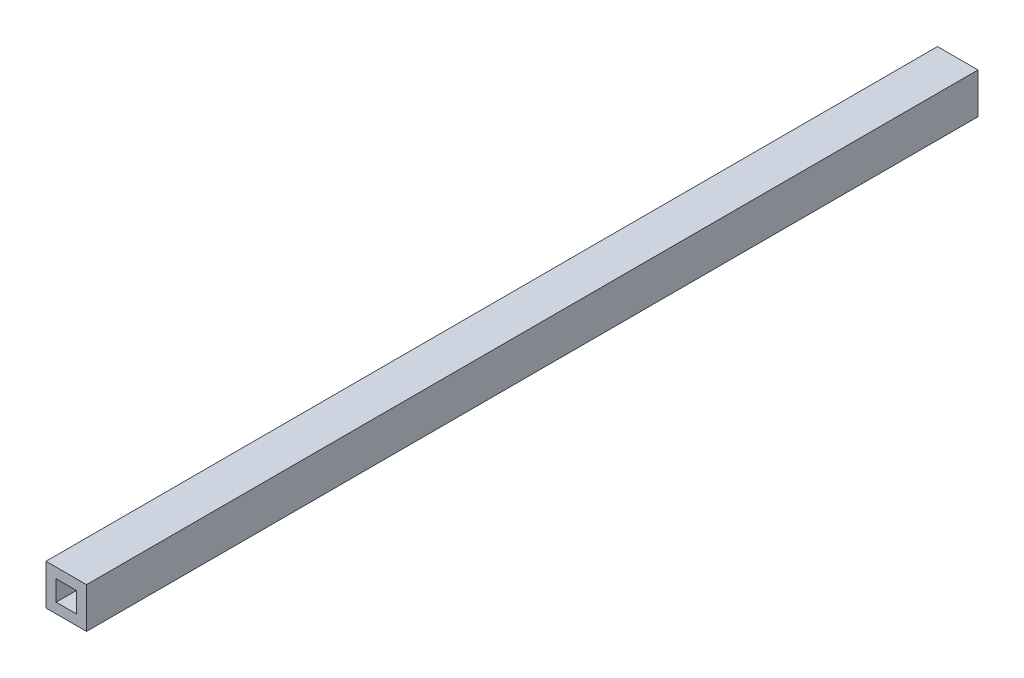
ISO-10303-21;
HEADER;
FILE_DESCRIPTION(('STEP AP214'),'2;1');
FILE_NAME('part.step','',(''),(''),'','','');
FILE_SCHEMA(('AUTOMOTIVE_DESIGN { 1 0 10303 214 1 1 1 1 }'));
ENDSEC;
DATA;
#1=APPLICATION_CONTEXT('core data for automotive mechanical design processes');
#2=APPLICATION_PROTOCOL_DEFINITION('international standard','automotive_design',2000,#1);
#3=PRODUCT_CONTEXT('',#1,'mechanical');
#4=PRODUCT('Part','Part','',(#3));
#5=PRODUCT_RELATED_PRODUCT_CATEGORY('part','',(#4));
#6=PRODUCT_DEFINITION_FORMATION('','',#4);
#7=PRODUCT_DEFINITION_CONTEXT('part definition',#1,'design');
#8=PRODUCT_DEFINITION('design','',#6,#7);
#9=PRODUCT_DEFINITION_SHAPE('','',#8);
#10=(LENGTH_UNIT() NAMED_UNIT(*) SI_UNIT(.MILLI.,.METRE.));
#11=(NAMED_UNIT(*) PLANE_ANGLE_UNIT() SI_UNIT($,.RADIAN.));
#12=(NAMED_UNIT(*) SI_UNIT($,.STERADIAN.) SOLID_ANGLE_UNIT());
#13=UNCERTAINTY_MEASURE_WITH_UNIT(LENGTH_MEASURE(1.E-05),#10,'distance_accuracy_value','');
#14=(GEOMETRIC_REPRESENTATION_CONTEXT(3) GLOBAL_UNCERTAINTY_ASSIGNED_CONTEXT((#13)) GLOBAL_UNIT_ASSIGNED_CONTEXT((#10,
#11,#12)) REPRESENTATION_CONTEXT('',''));
#15=CARTESIAN_POINT('',(0.,0.,0.));
#16=DIRECTION('',(0.,0.,1.));
#17=DIRECTION('',(1.,0.,0.));
#18=AXIS2_PLACEMENT_3D('',#15,#16,#17);
#19=CARTESIAN_POINT('',(0.,0.,440.));
#20=DIRECTION('',(0.,0.,1.));
#21=DIRECTION('',(1.,0.,0.));
#22=AXIS2_PLACEMENT_3D('',#19,#20,#21);
#23=PLANE('',#22);
#24=DIRECTION('',(0.,1.,0.));
#25=VECTOR('',#24,1.);
#26=CARTESIAN_POINT('',(10.,-10.,440.));
#27=LINE('',#26,#25);
#28=CARTESIAN_POINT('',(10.,-10.,440.));
#29=VERTEX_POINT('',#28);
#30=CARTESIAN_POINT('',(10.,10.,440.));
#31=VERTEX_POINT('',#30);
#32=EDGE_CURVE('E158',#29,#31,#27,.T.);
#33=ORIENTED_EDGE('',*,*,#32,.T.);
#34=DIRECTION('',(-1.,0.,0.));
#35=VECTOR('',#34,1.);
#36=CARTESIAN_POINT('',(-10.,10.,440.));
#37=LINE('',#36,#35);
#38=CARTESIAN_POINT('',(-10.,10.,440.));
#39=VERTEX_POINT('',#38);
#40=EDGE_CURVE('E161',#31,#39,#37,.T.);
#41=ORIENTED_EDGE('',*,*,#40,.T.);
#42=DIRECTION('',(0.,-1.,0.));
#43=VECTOR('',#42,1.);
#44=CARTESIAN_POINT('',(-10.,-10.,440.));
#45=LINE('',#44,#43);
#46=CARTESIAN_POINT('',(-10.,-10.,440.));
#47=VERTEX_POINT('',#46);
#48=EDGE_CURVE('E164',#39,#47,#45,.T.);
#49=ORIENTED_EDGE('',*,*,#48,.T.);
#50=DIRECTION('',(1.,0.,0.));
#51=VECTOR('',#50,1.);
#52=CARTESIAN_POINT('',(-10.,-10.,440.));
#53=LINE('',#52,#51);
#54=EDGE_CURVE('E166',#47,#29,#53,.T.);
#55=ORIENTED_EDGE('',*,*,#54,.T.);
#56=EDGE_LOOP('',(#33,#41,#49,#55));
#57=FACE_BOUND('',#56,.T.);
#58=DIRECTION('',(-1.,0.,0.));
#59=VECTOR('',#58,1.);
#60=CARTESIAN_POINT('',(0.,5.,440.));
#61=LINE('',#60,#59);
#62=CARTESIAN_POINT('',(5.,5.,440.));
#63=VERTEX_POINT('',#62);
#64=CARTESIAN_POINT('',(-5.,5.,440.));
#65=VERTEX_POINT('',#64);
#66=EDGE_CURVE('E130',#63,#65,#61,.T.);
#67=ORIENTED_EDGE('',*,*,#66,.F.);
#68=DIRECTION('',(0.,1.,0.));
#69=VECTOR('',#68,1.);
#70=CARTESIAN_POINT('',(5.,0.,440.));
#71=LINE('',#70,#69);
#72=CARTESIAN_POINT('',(5.,-5.,440.));
#73=VERTEX_POINT('',#72);
#74=EDGE_CURVE('E122',#73,#63,#71,.T.);
#75=ORIENTED_EDGE('',*,*,#74,.F.);
#76=DIRECTION('',(1.,0.,0.));
#77=VECTOR('',#76,1.);
#78=CARTESIAN_POINT('',(0.,-5.,440.));
#79=LINE('',#78,#77);
#80=CARTESIAN_POINT('',(-5.,-5.,440.));
#81=VERTEX_POINT('',#80);
#82=EDGE_CURVE('E144',#81,#73,#79,.T.);
#83=ORIENTED_EDGE('',*,*,#82,.F.);
#84=DIRECTION('',(0.,-1.,0.));
#85=VECTOR('',#84,1.);
#86=CARTESIAN_POINT('',(-5.,0.,440.));
#87=LINE('',#86,#85);
#88=EDGE_CURVE('E142',#65,#81,#87,.T.);
#89=ORIENTED_EDGE('',*,*,#88,.F.);
#90=EDGE_LOOP('',(#67,#75,#83,#89));
#91=FACE_BOUND('',#90,.T.);
#92=ADVANCED_FACE('F57',(#57,#91),#23,.T.);
#93=CARTESIAN_POINT('',(0.,0.,0.));
#94=DIRECTION('',(0.,0.,1.));
#95=DIRECTION('',(1.,0.,0.));
#96=AXIS2_PLACEMENT_3D('',#93,#94,#95);
#97=PLANE('',#96);
#98=DIRECTION('',(0.,1.,0.));
#99=VECTOR('',#98,1.);
#100=CARTESIAN_POINT('',(10.,-10.,0.));
#101=LINE('',#100,#99);
#102=CARTESIAN_POINT('',(10.,-10.,0.));
#103=VERTEX_POINT('',#102);
#104=CARTESIAN_POINT('',(10.,10.,0.));
#105=VERTEX_POINT('',#104);
#106=EDGE_CURVE('E138',#103,#105,#101,.T.);
#107=ORIENTED_EDGE('',*,*,#106,.F.);
#108=DIRECTION('',(1.,0.,0.));
#109=VECTOR('',#108,1.);
#110=CARTESIAN_POINT('',(-10.,-10.,0.));
#111=LINE('',#110,#109);
#112=CARTESIAN_POINT('',(-10.,-10.,0.));
#113=VERTEX_POINT('',#112);
#114=EDGE_CURVE('E162',#113,#103,#111,.T.);
#115=ORIENTED_EDGE('',*,*,#114,.F.);
#116=DIRECTION('',(0.,-1.,0.));
#117=VECTOR('',#116,1.);
#118=CARTESIAN_POINT('',(-10.,-10.,0.));
#119=LINE('',#118,#117);
#120=CARTESIAN_POINT('',(-10.,10.,0.));
#121=VERTEX_POINT('',#120);
#122=EDGE_CURVE('E173',#121,#113,#119,.T.);
#123=ORIENTED_EDGE('',*,*,#122,.F.);
#124=DIRECTION('',(-1.,0.,0.));
#125=VECTOR('',#124,1.);
#126=CARTESIAN_POINT('',(-10.,10.,0.));
#127=LINE('',#126,#125);
#128=EDGE_CURVE('E171',#105,#121,#127,.T.);
#129=ORIENTED_EDGE('',*,*,#128,.F.);
#130=EDGE_LOOP('',(#107,#115,#123,#129));
#131=FACE_BOUND('',#130,.T.);
#132=DIRECTION('',(0.,1.,0.));
#133=VECTOR('',#132,1.);
#134=CARTESIAN_POINT('',(5.,0.,0.));
#135=LINE('',#134,#133);
#136=CARTESIAN_POINT('',(5.,-5.,0.));
#137=VERTEX_POINT('',#136);
#138=CARTESIAN_POINT('',(5.,5.,0.));
#139=VERTEX_POINT('',#138);
#140=EDGE_CURVE('E80',#137,#139,#135,.T.);
#141=ORIENTED_EDGE('',*,*,#140,.T.);
#142=DIRECTION('',(-1.,0.,0.));
#143=VECTOR('',#142,1.);
#144=CARTESIAN_POINT('',(0.,5.,0.));
#145=LINE('',#144,#143);
#146=CARTESIAN_POINT('',(-5.,5.,0.));
#147=VERTEX_POINT('',#146);
#148=EDGE_CURVE('E137',#139,#147,#145,.T.);
#149=ORIENTED_EDGE('',*,*,#148,.T.);
#150=DIRECTION('',(0.,-1.,0.));
#151=VECTOR('',#150,1.);
#152=CARTESIAN_POINT('',(-5.,0.,0.));
#153=LINE('',#152,#151);
#154=CARTESIAN_POINT('',(-5.,-5.,0.));
#155=VERTEX_POINT('',#154);
#156=EDGE_CURVE('E150',#147,#155,#153,.T.);
#157=ORIENTED_EDGE('',*,*,#156,.T.);
#158=DIRECTION('',(1.,0.,0.));
#159=VECTOR('',#158,1.);
#160=CARTESIAN_POINT('',(0.,-5.,0.));
#161=LINE('',#160,#159);
#162=EDGE_CURVE('E131',#155,#137,#161,.T.);
#163=ORIENTED_EDGE('',*,*,#162,.T.);
#164=EDGE_LOOP('',(#141,#149,#157,#163));
#165=FACE_BOUND('',#164,.T.);
#166=ADVANCED_FACE('F191',(#131,#165),#97,.F.);
#167=CARTESIAN_POINT('',(10.,-10.,440.));
#168=DIRECTION('',(-1.,0.,0.));
#169=DIRECTION('',(0.,0.,1.));
#170=AXIS2_PLACEMENT_3D('',#167,#168,#169);
#171=PLANE('',#170);
#172=ORIENTED_EDGE('',*,*,#106,.T.);
#173=DIRECTION('',(0.,0.,-1.));
#174=VECTOR('',#173,1.);
#175=CARTESIAN_POINT('',(10.,10.,440.));
#176=LINE('',#175,#174);
#177=EDGE_CURVE('E12',#31,#105,#176,.T.);
#178=ORIENTED_EDGE('',*,*,#177,.F.);
#179=ORIENTED_EDGE('',*,*,#32,.F.);
#180=DIRECTION('',(0.,0.,-1.));
#181=VECTOR('',#180,1.);
#182=CARTESIAN_POINT('',(10.,-10.,440.));
#183=LINE('',#182,#181);
#184=EDGE_CURVE('E168',#29,#103,#183,.T.);
#185=ORIENTED_EDGE('',*,*,#184,.T.);
#186=EDGE_LOOP('',(#172,#178,#179,#185));
#187=FACE_BOUND('',#186,.T.);
#188=ADVANCED_FACE('F59',(#187),#171,.F.);
#189=CARTESIAN_POINT('',(-10.,10.,440.));
#190=DIRECTION('',(0.,-1.,0.));
#191=DIRECTION('',(0.,0.,-1.));
#192=AXIS2_PLACEMENT_3D('',#189,#190,#191);
#193=PLANE('',#192);
#194=ORIENTED_EDGE('',*,*,#128,.T.);
#195=DIRECTION('',(0.,0.,-1.));
#196=VECTOR('',#195,1.);
#197=CARTESIAN_POINT('',(-10.,10.,440.));
#198=LINE('',#197,#196);
#199=EDGE_CURVE('E65',#39,#121,#198,.T.);
#200=ORIENTED_EDGE('',*,*,#199,.F.);
#201=ORIENTED_EDGE('',*,*,#40,.F.);
#202=ORIENTED_EDGE('',*,*,#177,.T.);
#203=EDGE_LOOP('',(#194,#200,#201,#202));
#204=FACE_BOUND('',#203,.T.);
#205=ADVANCED_FACE('F201',(#204),#193,.F.);
#206=CARTESIAN_POINT('',(-10.,-10.,440.));
#207=DIRECTION('',(1.,0.,0.));
#208=DIRECTION('',(0.,0.,-1.));
#209=AXIS2_PLACEMENT_3D('',#206,#207,#208);
#210=PLANE('',#209);
#211=ORIENTED_EDGE('',*,*,#122,.T.);
#212=DIRECTION('',(0.,0.,-1.));
#213=VECTOR('',#212,1.);
#214=CARTESIAN_POINT('',(-10.,-10.,440.));
#215=LINE('',#214,#213);
#216=EDGE_CURVE('E178',#47,#113,#215,.T.);
#217=ORIENTED_EDGE('',*,*,#216,.F.);
#218=ORIENTED_EDGE('',*,*,#48,.F.);
#219=ORIENTED_EDGE('',*,*,#199,.T.);
#220=EDGE_LOOP('',(#211,#217,#218,#219));
#221=FACE_BOUND('',#220,.T.);
#222=ADVANCED_FACE('F185',(#221),#210,.F.);
#223=CARTESIAN_POINT('',(-10.,-10.,440.));
#224=DIRECTION('',(0.,1.,0.));
#225=DIRECTION('',(0.,0.,1.));
#226=AXIS2_PLACEMENT_3D('',#223,#224,#225);
#227=PLANE('',#226);
#228=ORIENTED_EDGE('',*,*,#114,.T.);
#229=ORIENTED_EDGE('',*,*,#184,.F.);
#230=ORIENTED_EDGE('',*,*,#54,.F.);
#231=ORIENTED_EDGE('',*,*,#216,.T.);
#232=EDGE_LOOP('',(#228,#229,#230,#231));
#233=FACE_BOUND('',#232,.T.);
#234=ADVANCED_FACE('F195',(#233),#227,.F.);
#235=CARTESIAN_POINT('',(5.,0.,440.));
#236=DIRECTION('',(-1.,0.,0.));
#237=DIRECTION('',(0.,0.,1.));
#238=AXIS2_PLACEMENT_3D('',#235,#236,#237);
#239=PLANE('',#238);
#240=ORIENTED_EDGE('',*,*,#140,.F.);
#241=DIRECTION('',(0.,0.,-1.));
#242=VECTOR('',#241,1.);
#243=CARTESIAN_POINT('',(5.,-5.,440.));
#244=LINE('',#243,#242);
#245=EDGE_CURVE('E126',#73,#137,#244,.T.);
#246=ORIENTED_EDGE('',*,*,#245,.F.);
#247=ORIENTED_EDGE('',*,*,#74,.T.);
#248=DIRECTION('',(0.,0.,-1.));
#249=VECTOR('',#248,1.);
#250=CARTESIAN_POINT('',(5.,5.,440.));
#251=LINE('',#250,#249);
#252=EDGE_CURVE('E125',#63,#139,#251,.T.);
#253=ORIENTED_EDGE('',*,*,#252,.T.);
#254=EDGE_LOOP('',(#240,#246,#247,#253));
#255=FACE_BOUND('',#254,.T.);
#256=ADVANCED_FACE('F124',(#255),#239,.T.);
#257=CARTESIAN_POINT('',(0.,5.,440.));
#258=DIRECTION('',(0.,-1.,0.));
#259=DIRECTION('',(0.,0.,-1.));
#260=AXIS2_PLACEMENT_3D('',#257,#258,#259);
#261=PLANE('',#260);
#262=ORIENTED_EDGE('',*,*,#148,.F.);
#263=ORIENTED_EDGE('',*,*,#252,.F.);
#264=ORIENTED_EDGE('',*,*,#66,.T.);
#265=DIRECTION('',(0.,0.,-1.));
#266=VECTOR('',#265,1.);
#267=CARTESIAN_POINT('',(-5.,5.,440.));
#268=LINE('',#267,#266);
#269=EDGE_CURVE('E139',#65,#147,#268,.T.);
#270=ORIENTED_EDGE('',*,*,#269,.T.);
#271=EDGE_LOOP('',(#262,#263,#264,#270));
#272=FACE_BOUND('',#271,.T.);
#273=ADVANCED_FACE('F134',(#272),#261,.T.);
#274=CARTESIAN_POINT('',(-5.,0.,440.));
#275=DIRECTION('',(1.,0.,0.));
#276=DIRECTION('',(0.,0.,-1.));
#277=AXIS2_PLACEMENT_3D('',#274,#275,#276);
#278=PLANE('',#277);
#279=ORIENTED_EDGE('',*,*,#156,.F.);
#280=ORIENTED_EDGE('',*,*,#269,.F.);
#281=ORIENTED_EDGE('',*,*,#88,.T.);
#282=DIRECTION('',(0.,0.,-1.));
#283=VECTOR('',#282,1.);
#284=CARTESIAN_POINT('',(-5.,-5.,440.));
#285=LINE('',#284,#283);
#286=EDGE_CURVE('E72',#81,#155,#285,.T.);
#287=ORIENTED_EDGE('',*,*,#286,.T.);
#288=EDGE_LOOP('',(#279,#280,#281,#287));
#289=FACE_BOUND('',#288,.T.);
#290=ADVANCED_FACE('F224',(#289),#278,.T.);
#291=CARTESIAN_POINT('',(0.,-5.,440.));
#292=DIRECTION('',(0.,1.,0.));
#293=DIRECTION('',(0.,0.,1.));
#294=AXIS2_PLACEMENT_3D('',#291,#292,#293);
#295=PLANE('',#294);
#296=ORIENTED_EDGE('',*,*,#162,.F.);
#297=ORIENTED_EDGE('',*,*,#286,.F.);
#298=ORIENTED_EDGE('',*,*,#82,.T.);
#299=ORIENTED_EDGE('',*,*,#245,.T.);
#300=EDGE_LOOP('',(#296,#297,#298,#299));
#301=FACE_BOUND('',#300,.T.);
#302=ADVANCED_FACE('F228',(#301),#295,.T.);
#303=CLOSED_SHELL('',(#92,#166,#188,#205,#222,#234,#256,#273,#290,#302));
#304=MANIFOLD_SOLID_BREP('B2',#303);
#305=ADVANCED_BREP_SHAPE_REPRESENTATION('',(#18,#304),#14);
#306=SHAPE_DEFINITION_REPRESENTATION(#9,#305);
ENDSEC;
END-ISO-10303-21;
